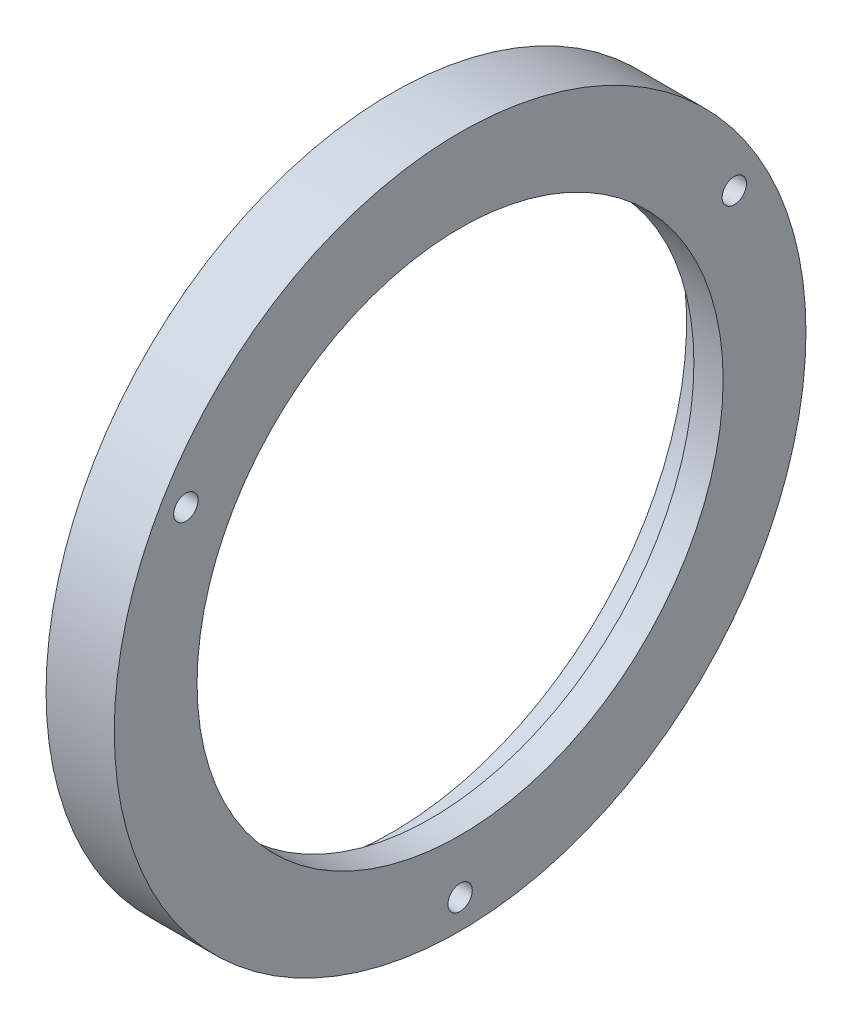
ISO-10303-21;
HEADER;
FILE_DESCRIPTION(('STEP AP214'),'2;1');
FILE_NAME('part.step','',(''),(''),'','','');
FILE_SCHEMA(('AUTOMOTIVE_DESIGN { 1 0 10303 214 1 1 1 1 }'));
ENDSEC;
DATA;
#1=APPLICATION_CONTEXT('core data for automotive mechanical design processes');
#2=APPLICATION_PROTOCOL_DEFINITION('international standard','automotive_design',2000,#1);
#3=PRODUCT_CONTEXT('',#1,'mechanical');
#4=PRODUCT('Part','Part','',(#3));
#5=PRODUCT_RELATED_PRODUCT_CATEGORY('part','',(#4));
#6=PRODUCT_DEFINITION_FORMATION('','',#4);
#7=PRODUCT_DEFINITION_CONTEXT('part definition',#1,'design');
#8=PRODUCT_DEFINITION('design','',#6,#7);
#9=PRODUCT_DEFINITION_SHAPE('','',#8);
#10=(LENGTH_UNIT() NAMED_UNIT(*) SI_UNIT(.MILLI.,.METRE.));
#11=(NAMED_UNIT(*) PLANE_ANGLE_UNIT() SI_UNIT($,.RADIAN.));
#12=(NAMED_UNIT(*) SI_UNIT($,.STERADIAN.) SOLID_ANGLE_UNIT());
#13=UNCERTAINTY_MEASURE_WITH_UNIT(LENGTH_MEASURE(1.E-05),#10,'distance_accuracy_value','');
#14=(GEOMETRIC_REPRESENTATION_CONTEXT(3) GLOBAL_UNCERTAINTY_ASSIGNED_CONTEXT((#13)) GLOBAL_UNIT_ASSIGNED_CONTEXT((#10,
#11,#12)) REPRESENTATION_CONTEXT('',''));
#15=CARTESIAN_POINT('',(0.,0.,0.));
#16=DIRECTION('',(0.,0.,1.));
#17=DIRECTION('',(1.,0.,0.));
#18=AXIS2_PLACEMENT_3D('',#15,#16,#17);
#19=CARTESIAN_POINT('',(135.7,35.5,0.));
#20=DIRECTION('',(1.,0.,0.));
#21=DIRECTION('',(0.,0.,-1.));
#22=AXIS2_PLACEMENT_3D('',#19,#20,#21);
#23=PLANE('',#22);
#24=CARTESIAN_POINT('',(135.7,16.25,28.1458256229943));
#25=DIRECTION('',(1.,0.,0.));
#26=DIRECTION('',(0.,0.,-1.));
#27=AXIS2_PLACEMENT_3D('',#24,#25,#26);
#28=CIRCLE('',#27,1.25);
#29=CARTESIAN_POINT('',(135.7,16.25,26.8958256229943));
#30=VERTEX_POINT('',#29);
#31=EDGE_CURVE('E56',#30,#30,#28,.F.);
#32=ORIENTED_EDGE('',*,*,#31,.F.);
#33=EDGE_LOOP('',(#32));
#34=FACE_BOUND('',#33,.T.);
#35=CARTESIAN_POINT('',(135.7,-32.5,0.));
#36=DIRECTION('',(1.,0.,0.));
#37=DIRECTION('',(0.,0.,-1.));
#38=AXIS2_PLACEMENT_3D('',#35,#36,#37);
#39=CIRCLE('',#38,1.25);
#40=CARTESIAN_POINT('',(135.7,-32.5,-1.25));
#41=VERTEX_POINT('',#40);
#42=EDGE_CURVE('E59',#41,#41,#39,.F.);
#43=ORIENTED_EDGE('',*,*,#42,.F.);
#44=EDGE_LOOP('',(#43));
#45=FACE_BOUND('',#44,.T.);
#46=CARTESIAN_POINT('',(135.7,16.25,-28.1458256229943));
#47=DIRECTION('',(1.,0.,0.));
#48=DIRECTION('',(0.,0.,-1.));
#49=AXIS2_PLACEMENT_3D('',#46,#47,#48);
#50=CIRCLE('',#49,1.25);
#51=CARTESIAN_POINT('',(135.7,16.25,-29.3958256229943));
#52=VERTEX_POINT('',#51);
#53=EDGE_CURVE('E62',#52,#52,#50,.F.);
#54=ORIENTED_EDGE('',*,*,#53,.F.);
#55=EDGE_LOOP('',(#54));
#56=FACE_BOUND('',#55,.T.);
#57=CARTESIAN_POINT('',(135.7,0.,0.));
#58=DIRECTION('',(-1.,0.,0.));
#59=DIRECTION('',(0.,0.,1.));
#60=AXIS2_PLACEMENT_3D('',#57,#58,#59);
#61=CIRCLE('',#60,30.25);
#62=CARTESIAN_POINT('',(135.7,0.,30.25));
#63=VERTEX_POINT('',#62);
#64=EDGE_CURVE('E10',#63,#63,#61,.T.);
#65=ORIENTED_EDGE('',*,*,#64,.F.);
#66=EDGE_LOOP('',(#65));
#67=FACE_BOUND('',#66,.T.);
#68=CARTESIAN_POINT('',(135.7,0.,0.));
#69=DIRECTION('',(-1.,0.,0.));
#70=DIRECTION('',(0.,0.,1.));
#71=AXIS2_PLACEMENT_3D('',#68,#69,#70);
#72=CIRCLE('',#71,35.5);
#73=CARTESIAN_POINT('',(135.7,0.,35.5));
#74=VERTEX_POINT('',#73);
#75=EDGE_CURVE('E53',#74,#74,#72,.T.);
#76=ORIENTED_EDGE('',*,*,#75,.T.);
#77=EDGE_LOOP('',(#76));
#78=FACE_BOUND('',#77,.T.);
#79=ADVANCED_FACE('F31',(#34,#45,#56,#67,#78),#23,.F.);
#80=CARTESIAN_POINT('',(-110.,0.,0.));
#81=DIRECTION('',(-1.,0.,0.));
#82=DIRECTION('',(0.,0.,1.));
#83=AXIS2_PLACEMENT_3D('',#80,#81,#82);
#84=CYLINDRICAL_SURFACE('',#83,30.25);
#85=CARTESIAN_POINT('',(139.7,0.,0.));
#86=DIRECTION('',(-1.,0.,0.));
#87=DIRECTION('',(0.,0.,1.));
#88=AXIS2_PLACEMENT_3D('',#85,#86,#87);
#89=CIRCLE('',#88,30.25);
#90=CARTESIAN_POINT('',(139.7,0.,30.25));
#91=VERTEX_POINT('',#90);
#92=EDGE_CURVE('E37',#91,#91,#89,.T.);
#93=ORIENTED_EDGE('',*,*,#92,.F.);
#94=EDGE_LOOP('',(#93));
#95=FACE_BOUND('',#94,.T.);
#96=ORIENTED_EDGE('',*,*,#64,.T.);
#97=EDGE_LOOP('',(#96));
#98=FACE_BOUND('',#97,.T.);
#99=ADVANCED_FACE('F99',(#95,#98),#84,.F.);
#100=CARTESIAN_POINT('',(139.7,30.25,0.));
#101=DIRECTION('',(1.,0.,0.));
#102=DIRECTION('',(0.,0.,-1.));
#103=AXIS2_PLACEMENT_3D('',#100,#101,#102);
#104=PLANE('',#103);
#105=CARTESIAN_POINT('',(139.7,0.,0.));
#106=DIRECTION('',(-1.,0.,0.));
#107=DIRECTION('',(0.,0.,1.));
#108=AXIS2_PLACEMENT_3D('',#105,#106,#107);
#109=CIRCLE('',#108,27.);
#110=CARTESIAN_POINT('',(139.7,0.,27.));
#111=VERTEX_POINT('',#110);
#112=EDGE_CURVE('E41',#111,#111,#109,.T.);
#113=ORIENTED_EDGE('',*,*,#112,.F.);
#114=EDGE_LOOP('',(#113));
#115=FACE_BOUND('',#114,.T.);
#116=ORIENTED_EDGE('',*,*,#92,.T.);
#117=EDGE_LOOP('',(#116));
#118=FACE_BOUND('',#117,.T.);
#119=ADVANCED_FACE('F94',(#115,#118),#104,.F.);
#120=CARTESIAN_POINT('',(-110.,0.,0.));
#121=DIRECTION('',(-1.,0.,0.));
#122=DIRECTION('',(0.,0.,1.));
#123=AXIS2_PLACEMENT_3D('',#120,#121,#122);
#124=CYLINDRICAL_SURFACE('',#123,27.);
#125=CARTESIAN_POINT('',(142.7,0.,0.));
#126=DIRECTION('',(-1.,0.,0.));
#127=DIRECTION('',(0.,0.,1.));
#128=AXIS2_PLACEMENT_3D('',#125,#126,#127);
#129=CIRCLE('',#128,27.);
#130=CARTESIAN_POINT('',(142.7,0.,27.));
#131=VERTEX_POINT('',#130);
#132=EDGE_CURVE('E45',#131,#131,#129,.T.);
#133=ORIENTED_EDGE('',*,*,#132,.F.);
#134=EDGE_LOOP('',(#133));
#135=FACE_BOUND('',#134,.T.);
#136=ORIENTED_EDGE('',*,*,#112,.T.);
#137=EDGE_LOOP('',(#136));
#138=FACE_BOUND('',#137,.T.);
#139=ADVANCED_FACE('F82',(#135,#138),#124,.F.);
#140=CARTESIAN_POINT('',(142.7,27.,0.));
#141=DIRECTION('',(-1.,0.,0.));
#142=DIRECTION('',(0.,0.,1.));
#143=AXIS2_PLACEMENT_3D('',#140,#141,#142);
#144=PLANE('',#143);
#145=CARTESIAN_POINT('',(142.7,16.25,28.1458256229943));
#146=DIRECTION('',(1.,0.,0.));
#147=DIRECTION('',(0.,0.,-1.));
#148=AXIS2_PLACEMENT_3D('',#145,#146,#147);
#149=CIRCLE('',#148,1.25);
#150=CARTESIAN_POINT('',(142.7,16.25,26.8958256229943));
#151=VERTEX_POINT('',#150);
#152=EDGE_CURVE('E65',#151,#151,#149,.T.);
#153=ORIENTED_EDGE('',*,*,#152,.F.);
#154=EDGE_LOOP('',(#153));
#155=FACE_BOUND('',#154,.T.);
#156=CARTESIAN_POINT('',(142.7,-32.5,0.));
#157=DIRECTION('',(1.,0.,0.));
#158=DIRECTION('',(0.,0.,-1.));
#159=AXIS2_PLACEMENT_3D('',#156,#157,#158);
#160=CIRCLE('',#159,1.25);
#161=CARTESIAN_POINT('',(142.7,-32.5,-1.25));
#162=VERTEX_POINT('',#161);
#163=EDGE_CURVE('E69',#162,#162,#160,.T.);
#164=ORIENTED_EDGE('',*,*,#163,.F.);
#165=EDGE_LOOP('',(#164));
#166=FACE_BOUND('',#165,.T.);
#167=CARTESIAN_POINT('',(142.7,16.25,-28.1458256229943));
#168=DIRECTION('',(1.,0.,0.));
#169=DIRECTION('',(0.,0.,-1.));
#170=AXIS2_PLACEMENT_3D('',#167,#168,#169);
#171=CIRCLE('',#170,1.25);
#172=CARTESIAN_POINT('',(142.7,16.25,-29.3958256229943));
#173=VERTEX_POINT('',#172);
#174=EDGE_CURVE('E66',#173,#173,#171,.T.);
#175=ORIENTED_EDGE('',*,*,#174,.F.);
#176=EDGE_LOOP('',(#175));
#177=FACE_BOUND('',#176,.T.);
#178=CARTESIAN_POINT('',(142.7,0.,0.));
#179=DIRECTION('',(-1.,0.,0.));
#180=DIRECTION('',(0.,0.,1.));
#181=AXIS2_PLACEMENT_3D('',#178,#179,#180);
#182=CIRCLE('',#181,35.5);
#183=CARTESIAN_POINT('',(142.7,0.,35.5));
#184=VERTEX_POINT('',#183);
#185=EDGE_CURVE('E50',#184,#184,#182,.T.);
#186=ORIENTED_EDGE('',*,*,#185,.F.);
#187=EDGE_LOOP('',(#186));
#188=FACE_BOUND('',#187,.T.);
#189=ORIENTED_EDGE('',*,*,#132,.T.);
#190=EDGE_LOOP('',(#189));
#191=FACE_BOUND('',#190,.T.);
#192=ADVANCED_FACE('F78',(#155,#166,#177,#188,#191),#144,.F.);
#193=CARTESIAN_POINT('',(-110.,0.,0.));
#194=DIRECTION('',(-1.,0.,0.));
#195=DIRECTION('',(0.,0.,1.));
#196=AXIS2_PLACEMENT_3D('',#193,#194,#195);
#197=CYLINDRICAL_SURFACE('',#196,35.5);
#198=ORIENTED_EDGE('',*,*,#75,.F.);
#199=EDGE_LOOP('',(#198));
#200=FACE_BOUND('',#199,.T.);
#201=ORIENTED_EDGE('',*,*,#185,.T.);
#202=EDGE_LOOP('',(#201));
#203=FACE_BOUND('',#202,.T.);
#204=ADVANCED_FACE('F81',(#200,#203),#197,.T.);
#205=CARTESIAN_POINT('',(142.7,16.25,-28.1458256229943));
#206=DIRECTION('',(-1.,0.,0.));
#207=DIRECTION('',(0.,0.,1.));
#208=AXIS2_PLACEMENT_3D('',#205,#206,#207);
#209=CYLINDRICAL_SURFACE('',#208,1.25);
#210=ORIENTED_EDGE('',*,*,#174,.T.);
#211=EDGE_LOOP('',(#210));
#212=FACE_BOUND('',#211,.T.);
#213=ORIENTED_EDGE('',*,*,#53,.T.);
#214=EDGE_LOOP('',(#213));
#215=FACE_BOUND('',#214,.T.);
#216=ADVANCED_FACE('F120',(#212,#215),#209,.F.);
#217=CARTESIAN_POINT('',(142.7,-32.5,0.));
#218=DIRECTION('',(-1.,0.,0.));
#219=DIRECTION('',(0.,0.,1.));
#220=AXIS2_PLACEMENT_3D('',#217,#218,#219);
#221=CYLINDRICAL_SURFACE('',#220,1.25);
#222=ORIENTED_EDGE('',*,*,#163,.T.);
#223=EDGE_LOOP('',(#222));
#224=FACE_BOUND('',#223,.T.);
#225=ORIENTED_EDGE('',*,*,#42,.T.);
#226=EDGE_LOOP('',(#225));
#227=FACE_BOUND('',#226,.T.);
#228=ADVANCED_FACE('F125',(#224,#227),#221,.F.);
#229=CARTESIAN_POINT('',(142.7,16.25,28.1458256229943));
#230=DIRECTION('',(-1.,0.,0.));
#231=DIRECTION('',(0.,0.,1.));
#232=AXIS2_PLACEMENT_3D('',#229,#230,#231);
#233=CYLINDRICAL_SURFACE('',#232,1.25);
#234=ORIENTED_EDGE('',*,*,#152,.T.);
#235=EDGE_LOOP('',(#234));
#236=FACE_BOUND('',#235,.T.);
#237=ORIENTED_EDGE('',*,*,#31,.T.);
#238=EDGE_LOOP('',(#237));
#239=FACE_BOUND('',#238,.T.);
#240=ADVANCED_FACE('F75',(#236,#239),#233,.F.);
#241=CLOSED_SHELL('',(#79,#99,#119,#139,#192,#204,#216,#228,#240));
#242=MANIFOLD_SOLID_BREP('B2',#241);
#243=ADVANCED_BREP_SHAPE_REPRESENTATION('',(#18,#242),#14);
#244=SHAPE_DEFINITION_REPRESENTATION(#9,#243);
ENDSEC;
END-ISO-10303-21;
